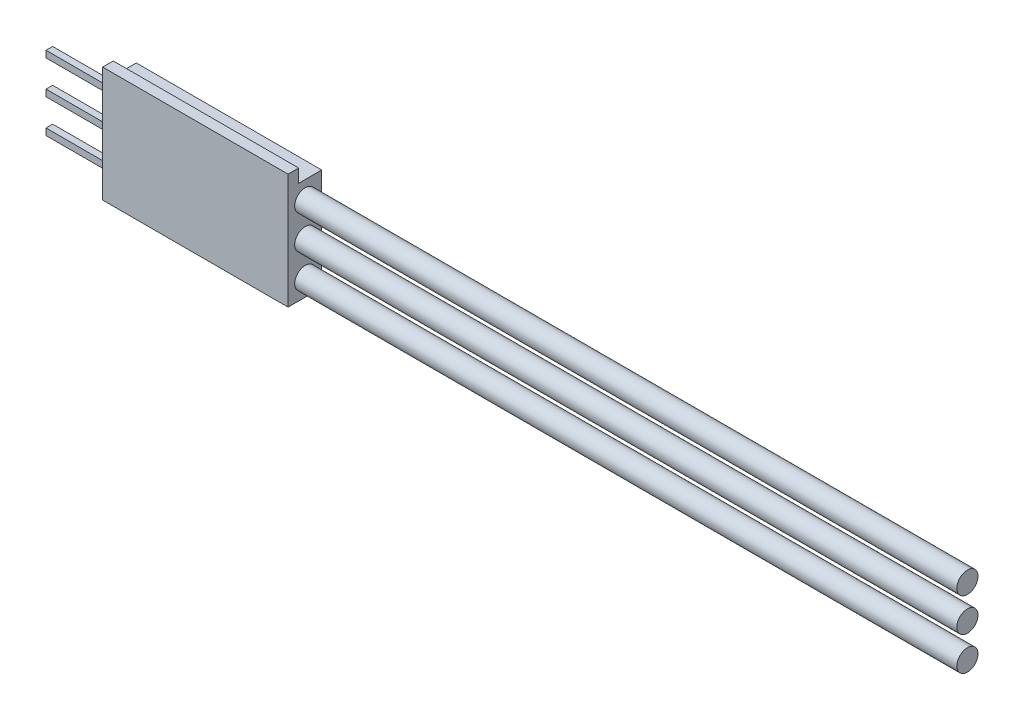
ISO-10303-21;
HEADER;
FILE_DESCRIPTION(('STEP AP214'),'2;1');
FILE_NAME('part.step','',(''),(''),'','','');
FILE_SCHEMA(('AUTOMOTIVE_DESIGN { 1 0 10303 214 1 1 1 1 }'));
ENDSEC;
DATA;
#1=APPLICATION_CONTEXT('core data for automotive mechanical design processes');
#2=APPLICATION_PROTOCOL_DEFINITION('international standard','automotive_design',2000,#1);
#3=PRODUCT_CONTEXT('',#1,'mechanical');
#4=PRODUCT('Part','Part','',(#3));
#5=PRODUCT_RELATED_PRODUCT_CATEGORY('part','',(#4));
#6=PRODUCT_DEFINITION_FORMATION('','',#4);
#7=PRODUCT_DEFINITION_CONTEXT('part definition',#1,'design');
#8=PRODUCT_DEFINITION('design','',#6,#7);
#9=PRODUCT_DEFINITION_SHAPE('','',#8);
#10=(LENGTH_UNIT() NAMED_UNIT(*) SI_UNIT(.MILLI.,.METRE.));
#11=(NAMED_UNIT(*) PLANE_ANGLE_UNIT() SI_UNIT($,.RADIAN.));
#12=(NAMED_UNIT(*) SI_UNIT($,.STERADIAN.) SOLID_ANGLE_UNIT());
#13=UNCERTAINTY_MEASURE_WITH_UNIT(LENGTH_MEASURE(1.E-05),#10,'distance_accuracy_value','');
#14=(GEOMETRIC_REPRESENTATION_CONTEXT(3) GLOBAL_UNCERTAINTY_ASSIGNED_CONTEXT((#13)) GLOBAL_UNIT_ASSIGNED_CONTEXT((#10,
#11,#12)) REPRESENTATION_CONTEXT('',''));
#15=CARTESIAN_POINT('',(0.,0.,0.));
#16=DIRECTION('',(0.,0.,1.));
#17=DIRECTION('',(1.,0.,0.));
#18=AXIS2_PLACEMENT_3D('',#15,#16,#17);
#19=CARTESIAN_POINT('',(7.027180723332,-2.54,0.));
#20=DIRECTION('',(1.,0.,0.));
#21=DIRECTION('',(0.,0.,-1.));
#22=AXIS2_PLACEMENT_3D('',#19,#20,#21);
#23=PLANE('',#22);
#24=CARTESIAN_POINT('',(7.027180723332,-2.54,1.17995077684313E-12));
#25=DIRECTION('',(1.,0.,0.));
#26=DIRECTION('',(0.,0.,-1.));
#27=AXIS2_PLACEMENT_3D('',#24,#25,#26);
#28=CIRCLE('',#27,0.800000000000761);
#29=CARTESIAN_POINT('',(7.027180723332,-2.54,-0.799999999999581));
#30=VERTEX_POINT('',#29);
#31=EDGE_CURVE('P0_E18',#30,#30,#28,.T.);
#32=ORIENTED_EDGE('',*,*,#31,.F.);
#33=EDGE_LOOP('',(#32));
#34=FACE_BOUND('',#33,.T.);
#35=ADVANCED_FACE('P0_F15',(#34),#23,.F.);
#36=CARTESIAN_POINT('',(57.02718072333,-2.54,0.));
#37=DIRECTION('',(1.,0.,0.));
#38=DIRECTION('',(0.,0.,-1.));
#39=AXIS2_PLACEMENT_3D('',#36,#37,#38);
#40=PLANE('',#39);
#41=CARTESIAN_POINT('',(57.02718072333,-2.54,1.17995077684313E-12));
#42=DIRECTION('',(1.,0.,0.));
#43=DIRECTION('',(0.,0.,-1.));
#44=AXIS2_PLACEMENT_3D('',#41,#42,#43);
#45=CIRCLE('',#44,0.800000000000761);
#46=CARTESIAN_POINT('',(57.02718072333,-2.54,-0.799999999999581));
#47=VERTEX_POINT('',#46);
#48=EDGE_CURVE('P0_E10',#47,#47,#45,.F.);
#49=ORIENTED_EDGE('',*,*,#48,.F.);
#50=EDGE_LOOP('',(#49));
#51=FACE_BOUND('',#50,.T.);
#52=ADVANCED_FACE('P0_F30',(#51),#40,.T.);
#53=CARTESIAN_POINT('',(6.027180723332,-2.54,1.17995077684313E-12));
#54=DIRECTION('',(1.,0.,0.));
#55=DIRECTION('',(0.,0.,-1.));
#56=AXIS2_PLACEMENT_3D('',#53,#54,#55);
#57=CYLINDRICAL_SURFACE('',#56,0.800000000000761);
#58=ORIENTED_EDGE('',*,*,#31,.T.);
#59=EDGE_LOOP('',(#58));
#60=FACE_BOUND('',#59,.T.);
#61=ORIENTED_EDGE('',*,*,#48,.T.);
#62=EDGE_LOOP('',(#61));
#63=FACE_BOUND('',#62,.T.);
#64=ADVANCED_FACE('P0_F27',(#60,#63),#57,.T.);
#65=CLOSED_SHELL('',(#35,#52,#64));
#66=MANIFOLD_SOLID_BREP('P0_B1',#65);
#67=CARTESIAN_POINT('',(7.027180723332,0.,0.));
#68=DIRECTION('',(1.,0.,0.));
#69=DIRECTION('',(0.,0.,-1.));
#70=AXIS2_PLACEMENT_3D('',#67,#68,#69);
#71=PLANE('',#70);
#72=CARTESIAN_POINT('',(7.027180723332,0.,0.));
#73=DIRECTION('',(1.,0.,0.));
#74=DIRECTION('',(0.,0.,-1.));
#75=AXIS2_PLACEMENT_3D('',#72,#73,#74);
#76=CIRCLE('',#75,0.799999999999974);
#77=CARTESIAN_POINT('',(7.027180723332,0.,-0.799999999999949));
#78=VERTEX_POINT('',#77);
#79=EDGE_CURVE('P1_E18',#78,#78,#76,.T.);
#80=ORIENTED_EDGE('',*,*,#79,.F.);
#81=EDGE_LOOP('',(#80));
#82=FACE_BOUND('',#81,.T.);
#83=ADVANCED_FACE('P1_F15',(#82),#71,.F.);
#84=CARTESIAN_POINT('',(57.02718072333,0.,0.));
#85=DIRECTION('',(1.,0.,0.));
#86=DIRECTION('',(0.,0.,-1.));
#87=AXIS2_PLACEMENT_3D('',#84,#85,#86);
#88=PLANE('',#87);
#89=CARTESIAN_POINT('',(57.02718072333,0.,0.));
#90=DIRECTION('',(1.,0.,0.));
#91=DIRECTION('',(0.,0.,-1.));
#92=AXIS2_PLACEMENT_3D('',#89,#90,#91);
#93=CIRCLE('',#92,0.799999999999974);
#94=CARTESIAN_POINT('',(57.02718072333,0.,-0.799999999999949));
#95=VERTEX_POINT('',#94);
#96=EDGE_CURVE('P1_E10',#95,#95,#93,.F.);
#97=ORIENTED_EDGE('',*,*,#96,.F.);
#98=EDGE_LOOP('',(#97));
#99=FACE_BOUND('',#98,.T.);
#100=ADVANCED_FACE('P1_F30',(#99),#88,.T.);
#101=CARTESIAN_POINT('',(6.027180723332,0.,0.));
#102=DIRECTION('',(1.,0.,0.));
#103=DIRECTION('',(0.,0.,-1.));
#104=AXIS2_PLACEMENT_3D('',#101,#102,#103);
#105=CYLINDRICAL_SURFACE('',#104,0.799999999999974);
#106=ORIENTED_EDGE('',*,*,#79,.T.);
#107=EDGE_LOOP('',(#106));
#108=FACE_BOUND('',#107,.T.);
#109=ORIENTED_EDGE('',*,*,#96,.T.);
#110=EDGE_LOOP('',(#109));
#111=FACE_BOUND('',#110,.T.);
#112=ADVANCED_FACE('P1_F27',(#108,#111),#105,.T.);
#113=CLOSED_SHELL('',(#83,#100,#112));
#114=MANIFOLD_SOLID_BREP('P1_B1',#113);
#115=CARTESIAN_POINT('',(7.027180723332,2.54,0.));
#116=DIRECTION('',(1.,0.,0.));
#117=DIRECTION('',(0.,0.,-1.));
#118=AXIS2_PLACEMENT_3D('',#115,#116,#117);
#119=PLANE('',#118);
#120=CARTESIAN_POINT('',(7.027180723332,2.54,-1.17995077684313E-12));
#121=DIRECTION('',(1.,0.,0.));
#122=DIRECTION('',(0.,0.,-1.));
#123=AXIS2_PLACEMENT_3D('',#120,#121,#122);
#124=CIRCLE('',#123,0.800000000000761);
#125=CARTESIAN_POINT('',(7.027180723332,2.54,-0.800000000001941));
#126=VERTEX_POINT('',#125);
#127=EDGE_CURVE('P2_E19',#126,#126,#124,.T.);
#128=ORIENTED_EDGE('',*,*,#127,.F.);
#129=EDGE_LOOP('',(#128));
#130=FACE_BOUND('',#129,.T.);
#131=ADVANCED_FACE('P2_F16',(#130),#119,.F.);
#132=CARTESIAN_POINT('',(57.02718072333,2.54,0.));
#133=DIRECTION('',(1.,0.,0.));
#134=DIRECTION('',(0.,0.,-1.));
#135=AXIS2_PLACEMENT_3D('',#132,#133,#134);
#136=PLANE('',#135);
#137=CARTESIAN_POINT('',(57.02718072333,2.54,-1.17995077684313E-12));
#138=DIRECTION('',(1.,0.,0.));
#139=DIRECTION('',(0.,0.,-1.));
#140=AXIS2_PLACEMENT_3D('',#137,#138,#139);
#141=CIRCLE('',#140,0.800000000000761);
#142=CARTESIAN_POINT('',(57.02718072333,2.54,-0.800000000001941));
#143=VERTEX_POINT('',#142);
#144=EDGE_CURVE('P2_E10',#143,#143,#141,.F.);
#145=ORIENTED_EDGE('',*,*,#144,.F.);
#146=EDGE_LOOP('',(#145));
#147=FACE_BOUND('',#146,.T.);
#148=ADVANCED_FACE('P2_F31',(#147),#136,.T.);
#149=CARTESIAN_POINT('',(6.027180723332,2.54,-1.17995077684313E-12));
#150=DIRECTION('',(1.,0.,0.));
#151=DIRECTION('',(0.,0.,-1.));
#152=AXIS2_PLACEMENT_3D('',#149,#150,#151);
#153=CYLINDRICAL_SURFACE('',#152,0.800000000000761);
#154=ORIENTED_EDGE('',*,*,#144,.T.);
#155=EDGE_LOOP('',(#154));
#156=FACE_BOUND('',#155,.T.);
#157=ORIENTED_EDGE('',*,*,#127,.T.);
#158=EDGE_LOOP('',(#157));
#159=FACE_BOUND('',#158,.T.);
#160=ADVANCED_FACE('P2_F28',(#156,#159),#153,.T.);
#161=CLOSED_SHELL('',(#131,#148,#160));
#162=MANIFOLD_SOLID_BREP('P2_B1',#161);
#163=CARTESIAN_POINT('',(-7.,-2.79,-0.25));
#164=DIRECTION('',(0.,-1.,0.));
#165=DIRECTION('',(0.,0.,-1.));
#166=AXIS2_PLACEMENT_3D('',#163,#164,#165);
#167=PLANE('',#166);
#168=DIRECTION('',(1.,0.,0.));
#169=VECTOR('',#168,1.);
#170=CARTESIAN_POINT('',(-7.,-2.79,0.25));
#171=LINE('',#170,#169);
#172=CARTESIAN_POINT('',(-12.3,-2.79,0.25));
#173=VERTEX_POINT('',#172);
#174=CARTESIAN_POINT('',(-7.,-2.79,0.25));
#175=VERTEX_POINT('',#174);
#176=EDGE_CURVE('P3_E142',#173,#175,#171,.T.);
#177=ORIENTED_EDGE('',*,*,#176,.F.);
#178=DIRECTION('',(0.,0.,-1.));
#179=VECTOR('',#178,1.);
#180=CARTESIAN_POINT('',(-12.3,-2.79,-0.25));
#181=LINE('',#180,#179);
#182=CARTESIAN_POINT('',(-12.3,-2.79,-0.25));
#183=VERTEX_POINT('',#182);
#184=EDGE_CURVE('P3_E147',#173,#183,#181,.T.);
#185=ORIENTED_EDGE('',*,*,#184,.T.);
#186=DIRECTION('',(-1.,0.,0.));
#187=VECTOR('',#186,1.);
#188=CARTESIAN_POINT('',(-7.,-2.79,-0.25));
#189=LINE('',#188,#187);
#190=CARTESIAN_POINT('',(-7.,-2.79,-0.25));
#191=VERTEX_POINT('',#190);
#192=EDGE_CURVE('P3_E145',#191,#183,#189,.T.);
#193=ORIENTED_EDGE('',*,*,#192,.F.);
#194=DIRECTION('',(0.,0.,-1.));
#195=VECTOR('',#194,1.);
#196=CARTESIAN_POINT('',(-7.,-2.79,-0.25));
#197=LINE('',#196,#195);
#198=EDGE_CURVE('P3_E19',#191,#175,#197,.F.);
#199=ORIENTED_EDGE('',*,*,#198,.T.);
#200=EDGE_LOOP('',(#177,#185,#193,#199));
#201=FACE_BOUND('',#200,.T.);
#202=ADVANCED_FACE('P3_F16',(#201),#167,.T.);
#203=CARTESIAN_POINT('',(-7.,0.25,-0.25));
#204=DIRECTION('',(0.,0.,-1.));
#205=DIRECTION('',(-1.,0.,0.));
#206=AXIS2_PLACEMENT_3D('',#203,#204,#205);
#207=PLANE('',#206);
#208=DIRECTION('',(1.,0.,0.));
#209=VECTOR('',#208,1.);
#210=CARTESIAN_POINT('',(-7.,-0.25,-0.25));
#211=LINE('',#210,#209);
#212=CARTESIAN_POINT('',(-12.3,-0.25,-0.25));
#213=VERTEX_POINT('',#212);
#214=CARTESIAN_POINT('',(-7.,-0.25,-0.25));
#215=VERTEX_POINT('',#214);
#216=EDGE_CURVE('P3_E183',#213,#215,#211,.T.);
#217=ORIENTED_EDGE('',*,*,#216,.F.);
#218=DIRECTION('',(0.,1.,0.));
#219=VECTOR('',#218,1.);
#220=CARTESIAN_POINT('',(-12.3,0.25,-0.25));
#221=LINE('',#220,#219);
#222=CARTESIAN_POINT('',(-12.3,0.25,-0.25));
#223=VERTEX_POINT('',#222);
#224=EDGE_CURVE('P3_E167',#213,#223,#221,.T.);
#225=ORIENTED_EDGE('',*,*,#224,.T.);
#226=DIRECTION('',(1.,0.,0.));
#227=VECTOR('',#226,1.);
#228=CARTESIAN_POINT('',(-7.,0.25,-0.25));
#229=LINE('',#228,#227);
#230=CARTESIAN_POINT('',(-7.,0.25,-0.25));
#231=VERTEX_POINT('',#230);
#232=EDGE_CURVE('P3_E193',#231,#223,#229,.F.);
#233=ORIENTED_EDGE('',*,*,#232,.F.);
#234=DIRECTION('',(0.,1.,0.));
#235=VECTOR('',#234,1.);
#236=CARTESIAN_POINT('',(-7.,0.25,-0.25));
#237=LINE('',#236,#235);
#238=EDGE_CURVE('P3_E169',#231,#215,#237,.F.);
#239=ORIENTED_EDGE('',*,*,#238,.T.);
#240=EDGE_LOOP('',(#217,#225,#233,#239));
#241=FACE_BOUND('',#240,.T.);
#242=ADVANCED_FACE('P3_F494',(#241),#207,.T.);
#243=CARTESIAN_POINT('',(-7.,2.79,-0.25));
#244=DIRECTION('',(0.,0.,-1.));
#245=DIRECTION('',(-1.,0.,0.));
#246=AXIS2_PLACEMENT_3D('',#243,#244,#245);
#247=PLANE('',#246);
#248=DIRECTION('',(1.,0.,0.));
#249=VECTOR('',#248,1.);
#250=CARTESIAN_POINT('',(-7.,2.29,-0.25));
#251=LINE('',#250,#249);
#252=CARTESIAN_POINT('',(-12.3,2.29,-0.25));
#253=VERTEX_POINT('',#252);
#254=CARTESIAN_POINT('',(-7.,2.29,-0.25));
#255=VERTEX_POINT('',#254);
#256=EDGE_CURVE('P3_E202',#253,#255,#251,.T.);
#257=ORIENTED_EDGE('',*,*,#256,.F.);
#258=DIRECTION('',(0.,1.,0.));
#259=VECTOR('',#258,1.);
#260=CARTESIAN_POINT('',(-12.3,2.79,-0.25));
#261=LINE('',#260,#259);
#262=CARTESIAN_POINT('',(-12.3,2.79,-0.25));
#263=VERTEX_POINT('',#262);
#264=EDGE_CURVE('P3_E160',#253,#263,#261,.T.);
#265=ORIENTED_EDGE('',*,*,#264,.T.);
#266=DIRECTION('',(1.,0.,0.));
#267=VECTOR('',#266,1.);
#268=CARTESIAN_POINT('',(-7.,2.79,-0.25));
#269=LINE('',#268,#267);
#270=CARTESIAN_POINT('',(-7.,2.79,-0.25));
#271=VERTEX_POINT('',#270);
#272=EDGE_CURVE('P3_E210',#271,#263,#269,.F.);
#273=ORIENTED_EDGE('',*,*,#272,.F.);
#274=DIRECTION('',(0.,1.,0.));
#275=VECTOR('',#274,1.);
#276=CARTESIAN_POINT('',(-7.,2.79,-0.25));
#277=LINE('',#276,#275);
#278=EDGE_CURVE('P3_E162',#271,#255,#277,.F.);
#279=ORIENTED_EDGE('',*,*,#278,.T.);
#280=EDGE_LOOP('',(#257,#265,#273,#279));
#281=FACE_BOUND('',#280,.T.);
#282=ADVANCED_FACE('P3_F486',(#281),#247,.T.);
#283=CARTESIAN_POINT('',(-7.,-2.79,0.25));
#284=DIRECTION('',(0.,0.,1.));
#285=DIRECTION('',(1.,0.,0.));
#286=AXIS2_PLACEMENT_3D('',#283,#284,#285);
#287=PLANE('',#286);
#288=DIRECTION('',(1.,0.,0.));
#289=VECTOR('',#288,1.);
#290=CARTESIAN_POINT('',(-7.,-2.29,0.25));
#291=LINE('',#290,#289);
#292=CARTESIAN_POINT('',(-12.3,-2.29,0.25));
#293=VERTEX_POINT('',#292);
#294=CARTESIAN_POINT('',(-7.,-2.29,0.25));
#295=VERTEX_POINT('',#294);
#296=EDGE_CURVE('P3_E223',#293,#295,#291,.T.);
#297=ORIENTED_EDGE('',*,*,#296,.F.);
#298=DIRECTION('',(0.,1.,0.));
#299=VECTOR('',#298,1.);
#300=CARTESIAN_POINT('',(-12.3,0.,0.25));
#301=LINE('',#300,#299);
#302=EDGE_CURVE('P3_E159',#173,#293,#301,.T.);
#303=ORIENTED_EDGE('',*,*,#302,.F.);
#304=ORIENTED_EDGE('',*,*,#176,.T.);
#305=DIRECTION('',(0.,1.,0.));
#306=VECTOR('',#305,1.);
#307=CARTESIAN_POINT('',(-7.,-2.79,0.25));
#308=LINE('',#307,#306);
#309=EDGE_CURVE('P3_E149',#175,#295,#308,.T.);
#310=ORIENTED_EDGE('',*,*,#309,.T.);
#311=EDGE_LOOP('',(#297,#303,#304,#310));
#312=FACE_BOUND('',#311,.T.);
#313=ADVANCED_FACE('P3_F157',(#312),#287,.T.);
#314=CARTESIAN_POINT('',(-7.,-2.29,-0.25));
#315=DIRECTION('',(0.,0.,-1.));
#316=DIRECTION('',(-1.,0.,0.));
#317=AXIS2_PLACEMENT_3D('',#314,#315,#316);
#318=PLANE('',#317);
#319=ORIENTED_EDGE('',*,*,#192,.T.);
#320=DIRECTION('',(0.,1.,0.));
#321=VECTOR('',#320,1.);
#322=CARTESIAN_POINT('',(-12.3,0.,-0.25));
#323=LINE('',#322,#321);
#324=CARTESIAN_POINT('',(-12.3,-2.29,-0.25));
#325=VERTEX_POINT('',#324);
#326=EDGE_CURVE('P3_E175',#325,#183,#323,.F.);
#327=ORIENTED_EDGE('',*,*,#326,.F.);
#328=DIRECTION('',(1.,0.,0.));
#329=VECTOR('',#328,1.);
#330=CARTESIAN_POINT('',(-7.,-2.29,-0.25));
#331=LINE('',#330,#329);
#332=CARTESIAN_POINT('',(-7.,-2.29,-0.25));
#333=VERTEX_POINT('',#332);
#334=EDGE_CURVE('P3_E225',#333,#325,#331,.F.);
#335=ORIENTED_EDGE('',*,*,#334,.F.);
#336=DIRECTION('',(0.,1.,0.));
#337=VECTOR('',#336,1.);
#338=CARTESIAN_POINT('',(-7.,-2.29,-0.25));
#339=LINE('',#338,#337);
#340=EDGE_CURVE('P3_E155',#333,#191,#339,.F.);
#341=ORIENTED_EDGE('',*,*,#340,.T.);
#342=EDGE_LOOP('',(#319,#327,#335,#341));
#343=FACE_BOUND('',#342,.T.);
#344=ADVANCED_FACE('P3_F173',(#343),#318,.T.);
#345=CARTESIAN_POINT('',(-12.3,0.,-1.27));
#346=DIRECTION('',(-1.,0.,0.));
#347=DIRECTION('',(0.,0.,1.));
#348=AXIS2_PLACEMENT_3D('',#345,#346,#347);
#349=PLANE('',#348);
#350=ORIENTED_EDGE('',*,*,#302,.T.);
#351=DIRECTION('',(0.,0.,1.));
#352=VECTOR('',#351,1.);
#353=CARTESIAN_POINT('',(-12.3,-2.29,0.25));
#354=LINE('',#353,#352);
#355=EDGE_CURVE('P3_E180',#325,#293,#354,.T.);
#356=ORIENTED_EDGE('',*,*,#355,.F.);
#357=ORIENTED_EDGE('',*,*,#326,.T.);
#358=ORIENTED_EDGE('',*,*,#184,.F.);
#359=EDGE_LOOP('',(#350,#356,#357,#358));
#360=FACE_BOUND('',#359,.T.);
#361=ADVANCED_FACE('P3_F178',(#360),#349,.T.);
#362=CARTESIAN_POINT('',(-7.,-0.25,-0.25));
#363=DIRECTION('',(0.,-1.,0.));
#364=DIRECTION('',(0.,0.,-1.));
#365=AXIS2_PLACEMENT_3D('',#362,#363,#364);
#366=PLANE('',#365);
#367=DIRECTION('',(1.,0.,0.));
#368=VECTOR('',#367,1.);
#369=CARTESIAN_POINT('',(-7.,-0.25,0.25));
#370=LINE('',#369,#368);
#371=CARTESIAN_POINT('',(-12.3,-0.25,0.25));
#372=VERTEX_POINT('',#371);
#373=CARTESIAN_POINT('',(-7.,-0.25,0.25));
#374=VERTEX_POINT('',#373);
#375=EDGE_CURVE('P3_E228',#372,#374,#370,.T.);
#376=ORIENTED_EDGE('',*,*,#375,.F.);
#377=DIRECTION('',(0.,0.,1.));
#378=VECTOR('',#377,1.);
#379=CARTESIAN_POINT('',(-12.3,-0.25,-1.27));
#380=LINE('',#379,#378);
#381=EDGE_CURVE('P3_E199',#213,#372,#380,.T.);
#382=ORIENTED_EDGE('',*,*,#381,.F.);
#383=ORIENTED_EDGE('',*,*,#216,.T.);
#384=DIRECTION('',(0.,0.,-1.));
#385=VECTOR('',#384,1.);
#386=CARTESIAN_POINT('',(-7.,-0.25,-0.25));
#387=LINE('',#386,#385);
#388=EDGE_CURVE('P3_E188',#215,#374,#387,.F.);
#389=ORIENTED_EDGE('',*,*,#388,.T.);
#390=EDGE_LOOP('',(#376,#382,#383,#389));
#391=FACE_BOUND('',#390,.T.);
#392=ADVANCED_FACE('P3_F455',(#391),#366,.T.);
#393=CARTESIAN_POINT('',(-7.,0.25,0.25));
#394=DIRECTION('',(0.,1.,0.));
#395=DIRECTION('',(0.,0.,1.));
#396=AXIS2_PLACEMENT_3D('',#393,#394,#395);
#397=PLANE('',#396);
#398=ORIENTED_EDGE('',*,*,#232,.T.);
#399=DIRECTION('',(0.,0.,1.));
#400=VECTOR('',#399,1.);
#401=CARTESIAN_POINT('',(-12.3,0.25,-1.27));
#402=LINE('',#401,#400);
#403=CARTESIAN_POINT('',(-12.3,0.25,0.25));
#404=VERTEX_POINT('',#403);
#405=EDGE_CURVE('P3_E196',#404,#223,#402,.F.);
#406=ORIENTED_EDGE('',*,*,#405,.F.);
#407=DIRECTION('',(1.,0.,0.));
#408=VECTOR('',#407,1.);
#409=CARTESIAN_POINT('',(-7.,0.25,0.25));
#410=LINE('',#409,#408);
#411=CARTESIAN_POINT('',(-7.,0.25,0.25));
#412=VERTEX_POINT('',#411);
#413=EDGE_CURVE('P3_E231',#412,#404,#410,.F.);
#414=ORIENTED_EDGE('',*,*,#413,.F.);
#415=DIRECTION('',(0.,0.,1.));
#416=VECTOR('',#415,1.);
#417=CARTESIAN_POINT('',(-7.,0.25,0.25));
#418=LINE('',#417,#416);
#419=EDGE_CURVE('P3_E190',#412,#231,#418,.F.);
#420=ORIENTED_EDGE('',*,*,#419,.T.);
#421=EDGE_LOOP('',(#398,#406,#414,#420));
#422=FACE_BOUND('',#421,.T.);
#423=ADVANCED_FACE('P3_F446',(#422),#397,.T.);
#424=CARTESIAN_POINT('',(-12.3,0.,-1.27));
#425=DIRECTION('',(-1.,0.,0.));
#426=DIRECTION('',(0.,0.,1.));
#427=AXIS2_PLACEMENT_3D('',#424,#425,#426);
#428=PLANE('',#427);
#429=ORIENTED_EDGE('',*,*,#381,.T.);
#430=DIRECTION('',(0.,1.,0.));
#431=VECTOR('',#430,1.);
#432=CARTESIAN_POINT('',(-12.3,-0.25,0.25));
#433=LINE('',#432,#431);
#434=EDGE_CURVE('P3_E234',#404,#372,#433,.F.);
#435=ORIENTED_EDGE('',*,*,#434,.F.);
#436=ORIENTED_EDGE('',*,*,#405,.T.);
#437=ORIENTED_EDGE('',*,*,#224,.F.);
#438=EDGE_LOOP('',(#429,#435,#436,#437));
#439=FACE_BOUND('',#438,.T.);
#440=ADVANCED_FACE('P3_F437',(#439),#428,.T.);
#441=CARTESIAN_POINT('',(-7.,2.29,-0.25));
#442=DIRECTION('',(0.,-1.,0.));
#443=DIRECTION('',(0.,0.,-1.));
#444=AXIS2_PLACEMENT_3D('',#441,#442,#443);
#445=PLANE('',#444);
#446=DIRECTION('',(1.,0.,0.));
#447=VECTOR('',#446,1.);
#448=CARTESIAN_POINT('',(-7.,2.29,0.25));
#449=LINE('',#448,#447);
#450=CARTESIAN_POINT('',(-12.3,2.29,0.25));
#451=VERTEX_POINT('',#450);
#452=CARTESIAN_POINT('',(-7.,2.29,0.25));
#453=VERTEX_POINT('',#452);
#454=EDGE_CURVE('P3_E237',#451,#453,#449,.T.);
#455=ORIENTED_EDGE('',*,*,#454,.F.);
#456=DIRECTION('',(0.,0.,1.));
#457=VECTOR('',#456,1.);
#458=CARTESIAN_POINT('',(-12.3,2.29,-1.27));
#459=LINE('',#458,#457);
#460=EDGE_CURVE('P3_E216',#253,#451,#459,.T.);
#461=ORIENTED_EDGE('',*,*,#460,.F.);
#462=ORIENTED_EDGE('',*,*,#256,.T.);
#463=DIRECTION('',(0.,0.,-1.));
#464=VECTOR('',#463,1.);
#465=CARTESIAN_POINT('',(-7.,2.29,-0.25));
#466=LINE('',#465,#464);
#467=EDGE_CURVE('P3_E205',#255,#453,#466,.F.);
#468=ORIENTED_EDGE('',*,*,#467,.T.);
#469=EDGE_LOOP('',(#455,#461,#462,#468));
#470=FACE_BOUND('',#469,.T.);
#471=ADVANCED_FACE('P3_F428',(#470),#445,.T.);
#472=CARTESIAN_POINT('',(-7.,2.79,0.25));
#473=DIRECTION('',(0.,1.,0.));
#474=DIRECTION('',(0.,0.,1.));
#475=AXIS2_PLACEMENT_3D('',#472,#473,#474);
#476=PLANE('',#475);
#477=ORIENTED_EDGE('',*,*,#272,.T.);
#478=DIRECTION('',(0.,0.,1.));
#479=VECTOR('',#478,1.);
#480=CARTESIAN_POINT('',(-12.3,2.79,-1.27));
#481=LINE('',#480,#479);
#482=CARTESIAN_POINT('',(-12.3,2.79,0.25));
#483=VERTEX_POINT('',#482);
#484=EDGE_CURVE('P3_E213',#483,#263,#481,.F.);
#485=ORIENTED_EDGE('',*,*,#484,.F.);
#486=DIRECTION('',(1.,0.,0.));
#487=VECTOR('',#486,1.);
#488=CARTESIAN_POINT('',(-7.,2.79,0.25));
#489=LINE('',#488,#487);
#490=CARTESIAN_POINT('',(-7.,2.79,0.25));
#491=VERTEX_POINT('',#490);
#492=EDGE_CURVE('P3_E240',#491,#483,#489,.F.);
#493=ORIENTED_EDGE('',*,*,#492,.F.);
#494=DIRECTION('',(0.,0.,1.));
#495=VECTOR('',#494,1.);
#496=CARTESIAN_POINT('',(-7.,2.79,0.25));
#497=LINE('',#496,#495);
#498=EDGE_CURVE('P3_E207',#491,#271,#497,.F.);
#499=ORIENTED_EDGE('',*,*,#498,.T.);
#500=EDGE_LOOP('',(#477,#485,#493,#499));
#501=FACE_BOUND('',#500,.T.);
#502=ADVANCED_FACE('P3_F419',(#501),#476,.T.);
#503=CARTESIAN_POINT('',(-12.3,0.,-1.27));
#504=DIRECTION('',(-1.,0.,0.));
#505=DIRECTION('',(0.,0.,1.));
#506=AXIS2_PLACEMENT_3D('',#503,#504,#505);
#507=PLANE('',#506);
#508=ORIENTED_EDGE('',*,*,#460,.T.);
#509=DIRECTION('',(0.,1.,0.));
#510=VECTOR('',#509,1.);
#511=CARTESIAN_POINT('',(-12.3,2.29,0.25));
#512=LINE('',#511,#510);
#513=EDGE_CURVE('P3_E243',#483,#451,#512,.F.);
#514=ORIENTED_EDGE('',*,*,#513,.F.);
#515=ORIENTED_EDGE('',*,*,#484,.T.);
#516=ORIENTED_EDGE('',*,*,#264,.F.);
#517=EDGE_LOOP('',(#508,#514,#515,#516));
#518=FACE_BOUND('',#517,.T.);
#519=ADVANCED_FACE('P3_F411',(#518),#507,.T.);
#520=CARTESIAN_POINT('',(-7.,3.85,0.47));
#521=DIRECTION('',(0.,0.,-1.));
#522=DIRECTION('',(-1.,0.,0.));
#523=AXIS2_PLACEMENT_3D('',#520,#521,#522);
#524=PLANE('',#523);
#525=DIRECTION('',(0.,1.,0.));
#526=VECTOR('',#525,1.);
#527=CARTESIAN_POINT('',(-7.,3.85,0.47));
#528=LINE('',#527,#526);
#529=CARTESIAN_POINT('',(-7.,3.85,0.47));
#530=VERTEX_POINT('',#529);
#531=CARTESIAN_POINT('',(-7.,4.85,0.47));
#532=VERTEX_POINT('',#531);
#533=EDGE_CURVE('P3_E221',#530,#532,#528,.T.);
#534=ORIENTED_EDGE('',*,*,#533,.T.);
#535=DIRECTION('',(1.,0.,0.));
#536=VECTOR('',#535,1.);
#537=CARTESIAN_POINT('',(-7.,4.85,0.47));
#538=LINE('',#537,#536);
#539=CARTESIAN_POINT('',(7.,4.85,0.47));
#540=VERTEX_POINT('',#539);
#541=EDGE_CURVE('P3_E251',#540,#532,#538,.F.);
#542=ORIENTED_EDGE('',*,*,#541,.F.);
#543=DIRECTION('',(0.,1.,0.));
#544=VECTOR('',#543,1.);
#545=CARTESIAN_POINT('',(7.,3.85,0.47));
#546=LINE('',#545,#544);
#547=CARTESIAN_POINT('',(7.,3.85,0.47));
#548=VERTEX_POINT('',#547);
#549=EDGE_CURVE('P3_E219',#540,#548,#546,.F.);
#550=ORIENTED_EDGE('',*,*,#549,.T.);
#551=DIRECTION('',(1.,0.,0.));
#552=VECTOR('',#551,1.);
#553=CARTESIAN_POINT('',(7.,3.85,0.47));
#554=LINE('',#553,#552);
#555=EDGE_CURVE('P3_E246',#530,#548,#554,.T.);
#556=ORIENTED_EDGE('',*,*,#555,.F.);
#557=EDGE_LOOP('',(#534,#542,#550,#556));
#558=FACE_BOUND('',#557,.T.);
#559=ADVANCED_FACE('P3_F312',(#558),#524,.T.);
#560=CARTESIAN_POINT('',(-7.,-2.29,0.25));
#561=DIRECTION('',(0.,1.,0.));
#562=DIRECTION('',(0.,0.,1.));
#563=AXIS2_PLACEMENT_3D('',#560,#561,#562);
#564=PLANE('',#563);
#565=ORIENTED_EDGE('',*,*,#334,.T.);
#566=ORIENTED_EDGE('',*,*,#355,.T.);
#567=ORIENTED_EDGE('',*,*,#296,.T.);
#568=DIRECTION('',(0.,0.,1.));
#569=VECTOR('',#568,1.);
#570=CARTESIAN_POINT('',(-7.,-2.29,-1.27));
#571=LINE('',#570,#569);
#572=EDGE_CURVE('P3_E152',#333,#295,#571,.T.);
#573=ORIENTED_EDGE('',*,*,#572,.F.);
#574=EDGE_LOOP('',(#565,#566,#567,#573));
#575=FACE_BOUND('',#574,.T.);
#576=ADVANCED_FACE('P3_F394',(#575),#564,.T.);
#577=CARTESIAN_POINT('',(-7.,-0.25,0.25));
#578=DIRECTION('',(0.,0.,1.));
#579=DIRECTION('',(1.,0.,0.));
#580=AXIS2_PLACEMENT_3D('',#577,#578,#579);
#581=PLANE('',#580);
#582=ORIENTED_EDGE('',*,*,#413,.T.);
#583=ORIENTED_EDGE('',*,*,#434,.T.);
#584=ORIENTED_EDGE('',*,*,#375,.T.);
#585=DIRECTION('',(0.,1.,0.));
#586=VECTOR('',#585,1.);
#587=CARTESIAN_POINT('',(-7.,3.85,0.25));
#588=LINE('',#587,#586);
#589=EDGE_CURVE('P3_E255',#412,#374,#588,.F.);
#590=ORIENTED_EDGE('',*,*,#589,.F.);
#591=EDGE_LOOP('',(#582,#583,#584,#590));
#592=FACE_BOUND('',#591,.T.);
#593=ADVANCED_FACE('P3_F385',(#592),#581,.T.);
#594=CARTESIAN_POINT('',(-7.,2.29,0.25));
#595=DIRECTION('',(0.,0.,1.));
#596=DIRECTION('',(1.,0.,0.));
#597=AXIS2_PLACEMENT_3D('',#594,#595,#596);
#598=PLANE('',#597);
#599=ORIENTED_EDGE('',*,*,#492,.T.);
#600=ORIENTED_EDGE('',*,*,#513,.T.);
#601=ORIENTED_EDGE('',*,*,#454,.T.);
#602=DIRECTION('',(0.,1.,0.));
#603=VECTOR('',#602,1.);
#604=CARTESIAN_POINT('',(-7.,3.85,0.25));
#605=LINE('',#604,#603);
#606=EDGE_CURVE('P3_E258',#491,#453,#605,.F.);
#607=ORIENTED_EDGE('',*,*,#606,.F.);
#608=EDGE_LOOP('',(#599,#600,#601,#607));
#609=FACE_BOUND('',#608,.T.);
#610=ADVANCED_FACE('P3_F323',(#609),#598,.T.);
#611=CARTESIAN_POINT('',(0.,0.,-1.27));
#612=DIRECTION('',(0.,0.,1.));
#613=DIRECTION('',(1.,0.,0.));
#614=AXIS2_PLACEMENT_3D('',#611,#612,#613);
#615=PLANE('',#614);
#616=DIRECTION('',(1.,0.,0.));
#617=VECTOR('',#616,1.);
#618=CARTESIAN_POINT('',(-7.,-3.85,-1.27));
#619=LINE('',#618,#617);
#620=CARTESIAN_POINT('',(-7.,-3.85,-1.27));
#621=VERTEX_POINT('',#620);
#622=CARTESIAN_POINT('',(7.,-3.85,-1.27));
#623=VERTEX_POINT('',#622);
#624=EDGE_CURVE('P3_E272',#621,#623,#619,.T.);
#625=ORIENTED_EDGE('',*,*,#624,.F.);
#626=DIRECTION('',(0.,1.,0.));
#627=VECTOR('',#626,1.);
#628=CARTESIAN_POINT('',(-7.,3.85,-1.27));
#629=LINE('',#628,#627);
#630=CARTESIAN_POINT('',(-7.,3.85,-1.27));
#631=VERTEX_POINT('',#630);
#632=EDGE_CURVE('P3_E264',#631,#621,#629,.F.);
#633=ORIENTED_EDGE('',*,*,#632,.F.);
#634=DIRECTION('',(1.,0.,0.));
#635=VECTOR('',#634,1.);
#636=CARTESIAN_POINT('',(7.,3.85,-1.27));
#637=LINE('',#636,#635);
#638=CARTESIAN_POINT('',(7.,3.85,-1.27));
#639=VERTEX_POINT('',#638);
#640=EDGE_CURVE('P3_E249',#639,#631,#637,.F.);
#641=ORIENTED_EDGE('',*,*,#640,.F.);
#642=DIRECTION('',(0.,1.,0.));
#643=VECTOR('',#642,1.);
#644=CARTESIAN_POINT('',(7.,-3.85,-1.27));
#645=LINE('',#644,#643);
#646=EDGE_CURVE('P3_E278',#623,#639,#645,.T.);
#647=ORIENTED_EDGE('',*,*,#646,.F.);
#648=EDGE_LOOP('',(#625,#633,#641,#647));
#649=FACE_BOUND('',#648,.T.);
#650=ADVANCED_FACE('P3_F302',(#649),#615,.F.);
#651=CARTESIAN_POINT('',(7.,3.85,-1.27));
#652=DIRECTION('',(0.,1.,0.));
#653=DIRECTION('',(0.,0.,1.));
#654=AXIS2_PLACEMENT_3D('',#651,#652,#653);
#655=PLANE('',#654);
#656=DIRECTION('',(0.,0.,-1.));
#657=VECTOR('',#656,1.);
#658=CARTESIAN_POINT('',(7.,3.85,-1.27));
#659=LINE('',#658,#657);
#660=EDGE_CURVE('P3_E281',#639,#548,#659,.F.);
#661=ORIENTED_EDGE('',*,*,#660,.F.);
#662=ORIENTED_EDGE('',*,*,#640,.T.);
#663=DIRECTION('',(0.,0.,1.));
#664=VECTOR('',#663,1.);
#665=CARTESIAN_POINT('',(-7.,3.85,-1.27));
#666=LINE('',#665,#664);
#667=EDGE_CURVE('P3_E261',#530,#631,#666,.F.);
#668=ORIENTED_EDGE('',*,*,#667,.F.);
#669=ORIENTED_EDGE('',*,*,#555,.T.);
#670=EDGE_LOOP('',(#661,#662,#668,#669));
#671=FACE_BOUND('',#670,.T.);
#672=ADVANCED_FACE('P3_F314',(#671),#655,.T.);
#673=CARTESIAN_POINT('',(-7.,4.85,0.47));
#674=DIRECTION('',(0.,1.,0.));
#675=DIRECTION('',(0.,0.,1.));
#676=AXIS2_PLACEMENT_3D('',#673,#674,#675);
#677=PLANE('',#676);
#678=DIRECTION('',(1.,0.,0.));
#679=VECTOR('',#678,1.);
#680=CARTESIAN_POINT('',(0.,4.85,1.27));
#681=LINE('',#680,#679);
#682=CARTESIAN_POINT('',(7.,4.85,1.27));
#683=VERTEX_POINT('',#682);
#684=CARTESIAN_POINT('',(-7.,4.85,1.27));
#685=VERTEX_POINT('',#684);
#686=EDGE_CURVE('P3_E284',#683,#685,#681,.F.);
#687=ORIENTED_EDGE('',*,*,#686,.F.);
#688=DIRECTION('',(0.,0.,-1.));
#689=VECTOR('',#688,1.);
#690=CARTESIAN_POINT('',(7.,4.85,-1.27));
#691=LINE('',#690,#689);
#692=EDGE_CURVE('P3_E274',#540,#683,#691,.F.);
#693=ORIENTED_EDGE('',*,*,#692,.F.);
#694=ORIENTED_EDGE('',*,*,#541,.T.);
#695=DIRECTION('',(0.,0.,1.));
#696=VECTOR('',#695,1.);
#697=CARTESIAN_POINT('',(-7.,4.85,-1.27));
#698=LINE('',#697,#696);
#699=EDGE_CURVE('P3_E266',#685,#532,#698,.F.);
#700=ORIENTED_EDGE('',*,*,#699,.F.);
#701=EDGE_LOOP('',(#687,#693,#694,#700));
#702=FACE_BOUND('',#701,.T.);
#703=ADVANCED_FACE('P3_F309',(#702),#677,.T.);
#704=CARTESIAN_POINT('',(-7.,3.85,-1.27));
#705=DIRECTION('',(-1.,0.,0.));
#706=DIRECTION('',(0.,0.,1.));
#707=AXIS2_PLACEMENT_3D('',#704,#705,#706);
#708=PLANE('',#707);
#709=DIRECTION('',(0.,1.,0.));
#710=VECTOR('',#709,1.);
#711=CARTESIAN_POINT('',(-7.,0.,1.27));
#712=LINE('',#711,#710);
#713=CARTESIAN_POINT('',(-7.,-3.85,1.27));
#714=VERTEX_POINT('',#713);
#715=EDGE_CURVE('P3_E287',#685,#714,#712,.F.);
#716=ORIENTED_EDGE('',*,*,#715,.F.);
#717=ORIENTED_EDGE('',*,*,#699,.T.);
#718=ORIENTED_EDGE('',*,*,#533,.F.);
#719=ORIENTED_EDGE('',*,*,#667,.T.);
#720=ORIENTED_EDGE('',*,*,#632,.T.);
#721=DIRECTION('',(0.,0.,-1.));
#722=VECTOR('',#721,1.);
#723=CARTESIAN_POINT('',(-7.,-3.85,-1.27));
#724=LINE('',#723,#722);
#725=EDGE_CURVE('P3_E269',#714,#621,#724,.T.);
#726=ORIENTED_EDGE('',*,*,#725,.F.);
#727=EDGE_LOOP('',(#716,#717,#718,#719,#720,#726));
#728=FACE_BOUND('',#727,.T.);
#729=ORIENTED_EDGE('',*,*,#498,.F.);
#730=ORIENTED_EDGE('',*,*,#606,.T.);
#731=ORIENTED_EDGE('',*,*,#467,.F.);
#732=ORIENTED_EDGE('',*,*,#278,.F.);
#733=EDGE_LOOP('',(#729,#730,#731,#732));
#734=FACE_BOUND('',#733,.T.);
#735=ORIENTED_EDGE('',*,*,#419,.F.);
#736=ORIENTED_EDGE('',*,*,#589,.T.);
#737=ORIENTED_EDGE('',*,*,#388,.F.);
#738=ORIENTED_EDGE('',*,*,#238,.F.);
#739=EDGE_LOOP('',(#735,#736,#737,#738));
#740=FACE_BOUND('',#739,.T.);
#741=ORIENTED_EDGE('',*,*,#340,.F.);
#742=ORIENTED_EDGE('',*,*,#572,.T.);
#743=ORIENTED_EDGE('',*,*,#309,.F.);
#744=ORIENTED_EDGE('',*,*,#198,.F.);
#745=EDGE_LOOP('',(#741,#742,#743,#744));
#746=FACE_BOUND('',#745,.T.);
#747=ADVANCED_FACE('P3_F150',(#728,#734,#740,#746),#708,.T.);
#748=CARTESIAN_POINT('',(-7.,-3.85,-1.27));
#749=DIRECTION('',(0.,-1.,0.));
#750=DIRECTION('',(0.,0.,-1.));
#751=AXIS2_PLACEMENT_3D('',#748,#749,#750);
#752=PLANE('',#751);
#753=DIRECTION('',(0.,0.,-1.));
#754=VECTOR('',#753,1.);
#755=CARTESIAN_POINT('',(7.,-3.85,-1.27));
#756=LINE('',#755,#754);
#757=CARTESIAN_POINT('',(7.,-3.85,1.27));
#758=VERTEX_POINT('',#757);
#759=EDGE_CURVE('P3_E34',#758,#623,#756,.T.);
#760=ORIENTED_EDGE('',*,*,#759,.F.);
#761=DIRECTION('',(1.,0.,0.));
#762=VECTOR('',#761,1.);
#763=CARTESIAN_POINT('',(0.,-3.85,1.27));
#764=LINE('',#763,#762);
#765=EDGE_CURVE('P3_E25',#714,#758,#764,.T.);
#766=ORIENTED_EDGE('',*,*,#765,.F.);
#767=ORIENTED_EDGE('',*,*,#725,.T.);
#768=ORIENTED_EDGE('',*,*,#624,.T.);
#769=EDGE_LOOP('',(#760,#766,#767,#768));
#770=FACE_BOUND('',#769,.T.);
#771=ADVANCED_FACE('P3_F294',(#770),#752,.T.);
#772=CARTESIAN_POINT('',(7.,-3.85,-1.27));
#773=DIRECTION('',(1.,0.,0.));
#774=DIRECTION('',(0.,0.,-1.));
#775=AXIS2_PLACEMENT_3D('',#772,#773,#774);
#776=PLANE('',#775);
#777=ORIENTED_EDGE('',*,*,#660,.T.);
#778=ORIENTED_EDGE('',*,*,#549,.F.);
#779=ORIENTED_EDGE('',*,*,#692,.T.);
#780=DIRECTION('',(0.,1.,0.));
#781=VECTOR('',#780,1.);
#782=CARTESIAN_POINT('',(7.,0.,1.27));
#783=LINE('',#782,#781);
#784=EDGE_CURVE('P3_E10',#758,#683,#783,.T.);
#785=ORIENTED_EDGE('',*,*,#784,.F.);
#786=ORIENTED_EDGE('',*,*,#759,.T.);
#787=ORIENTED_EDGE('',*,*,#646,.T.);
#788=EDGE_LOOP('',(#777,#778,#779,#785,#786,#787));
#789=FACE_BOUND('',#788,.T.);
#790=ADVANCED_FACE('P3_F305',(#789),#776,.T.);
#791=CARTESIAN_POINT('',(0.,0.,1.27));
#792=DIRECTION('',(0.,0.,1.));
#793=DIRECTION('',(1.,0.,0.));
#794=AXIS2_PLACEMENT_3D('',#791,#792,#793);
#795=PLANE('',#794);
#796=ORIENTED_EDGE('',*,*,#765,.T.);
#797=ORIENTED_EDGE('',*,*,#784,.T.);
#798=ORIENTED_EDGE('',*,*,#686,.T.);
#799=ORIENTED_EDGE('',*,*,#715,.T.);
#800=EDGE_LOOP('',(#796,#797,#798,#799));
#801=FACE_BOUND('',#800,.T.);
#802=ADVANCED_FACE('P3_F292',(#801),#795,.T.);
#803=CLOSED_SHELL('',(#202,#242,#282,#313,#344,#361,#392,#423,#440,#471,#502,#519,#559,#576,
#593,#610,#650,#672,#703,#747,#771,#790,#802));
#804=MANIFOLD_SOLID_BREP('P3_B1',#803);
#805=ADVANCED_BREP_SHAPE_REPRESENTATION('',(#18,#66,#114,#162,#804),#14);
#806=SHAPE_DEFINITION_REPRESENTATION(#9,#805);
ENDSEC;
END-ISO-10303-21;
